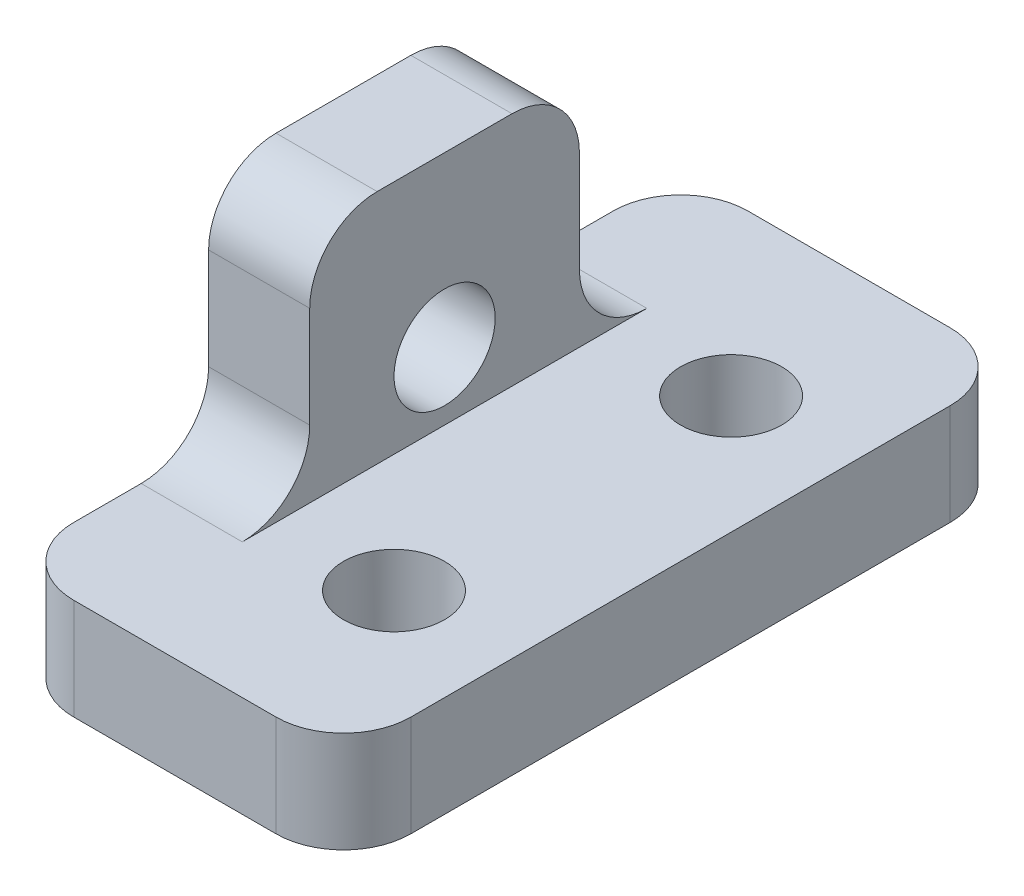
ISO-10303-21;
HEADER;
FILE_DESCRIPTION(('STEP AP214'),'2;1');
FILE_NAME('part.step','',(''),(''),'','','');
FILE_SCHEMA(('AUTOMOTIVE_DESIGN { 1 0 10303 214 1 1 1 1 }'));
ENDSEC;
DATA;
#1=APPLICATION_CONTEXT('core data for automotive mechanical design processes');
#2=APPLICATION_PROTOCOL_DEFINITION('international standard','automotive_design',2000,#1);
#3=PRODUCT_CONTEXT('',#1,'mechanical');
#4=PRODUCT('Part','Part','',(#3));
#5=PRODUCT_RELATED_PRODUCT_CATEGORY('part','',(#4));
#6=PRODUCT_DEFINITION_FORMATION('','',#4);
#7=PRODUCT_DEFINITION_CONTEXT('part definition',#1,'design');
#8=PRODUCT_DEFINITION('design','',#6,#7);
#9=PRODUCT_DEFINITION_SHAPE('','',#8);
#10=(LENGTH_UNIT() NAMED_UNIT(*) SI_UNIT(.MILLI.,.METRE.));
#11=(NAMED_UNIT(*) PLANE_ANGLE_UNIT() SI_UNIT($,.RADIAN.));
#12=(NAMED_UNIT(*) SI_UNIT($,.STERADIAN.) SOLID_ANGLE_UNIT());
#13=UNCERTAINTY_MEASURE_WITH_UNIT(LENGTH_MEASURE(1.E-05),#10,'distance_accuracy_value','');
#14=(GEOMETRIC_REPRESENTATION_CONTEXT(3) GLOBAL_UNCERTAINTY_ASSIGNED_CONTEXT((#13)) GLOBAL_UNIT_ASSIGNED_CONTEXT((#10,
#11,#12)) REPRESENTATION_CONTEXT('',''));
#15=CARTESIAN_POINT('',(0.,0.,0.));
#16=DIRECTION('',(0.,0.,1.));
#17=DIRECTION('',(1.,0.,0.));
#18=AXIS2_PLACEMENT_3D('',#15,#16,#17);
#19=CARTESIAN_POINT('',(3.,0.,0.));
#20=DIRECTION('',(1.,0.,0.));
#21=DIRECTION('',(0.,0.,-1.));
#22=AXIS2_PLACEMENT_3D('',#19,#20,#21);
#23=PLANE('',#22);
#24=DIRECTION('',(0.,1.,0.));
#25=VECTOR('',#24,1.);
#26=CARTESIAN_POINT('',(3.,10.,-14.));
#27=LINE('',#26,#25);
#28=CARTESIAN_POINT('',(3.,5.,-14.));
#29=VERTEX_POINT('',#28);
#30=CARTESIAN_POINT('',(3.,8.,-14.));
#31=VERTEX_POINT('',#30);
#32=EDGE_CURVE('E318',#29,#31,#27,.T.);
#33=ORIENTED_EDGE('',*,*,#32,.T.);
#34=CARTESIAN_POINT('',(3.,8.,-12.));
#35=DIRECTION('',(1.,0.,0.));
#36=DIRECTION('',(0.,0.,-1.));
#37=AXIS2_PLACEMENT_3D('',#34,#35,#36);
#38=CIRCLE('',#37,2.);
#39=CARTESIAN_POINT('',(3.,10.,-12.));
#40=VERTEX_POINT('',#39);
#41=EDGE_CURVE('E68',#31,#40,#38,.T.);
#42=ORIENTED_EDGE('',*,*,#41,.T.);
#43=DIRECTION('',(0.,0.,1.));
#44=VECTOR('',#43,1.);
#45=CARTESIAN_POINT('',(3.,10.,-6.));
#46=LINE('',#45,#44);
#47=CARTESIAN_POINT('',(3.,10.,-8.));
#48=VERTEX_POINT('',#47);
#49=EDGE_CURVE('E312',#40,#48,#46,.T.);
#50=ORIENTED_EDGE('',*,*,#49,.T.);
#51=CARTESIAN_POINT('',(3.,8.,-8.));
#52=DIRECTION('',(1.,0.,0.));
#53=DIRECTION('',(0.,0.,-1.));
#54=AXIS2_PLACEMENT_3D('',#51,#52,#53);
#55=CIRCLE('',#54,2.);
#56=CARTESIAN_POINT('',(3.,8.,-6.));
#57=VERTEX_POINT('',#56);
#58=EDGE_CURVE('E274',#48,#57,#55,.T.);
#59=ORIENTED_EDGE('',*,*,#58,.T.);
#60=DIRECTION('',(0.,-1.,0.));
#61=VECTOR('',#60,1.);
#62=CARTESIAN_POINT('',(3.,10.,-6.));
#63=LINE('',#62,#61);
#64=CARTESIAN_POINT('',(3.,5.,-6.));
#65=VERTEX_POINT('',#64);
#66=EDGE_CURVE('E309',#57,#65,#63,.T.);
#67=ORIENTED_EDGE('',*,*,#66,.T.);
#68=CARTESIAN_POINT('',(3.,5.,-4.));
#69=DIRECTION('',(1.,0.,0.));
#70=DIRECTION('',(0.,0.,-1.));
#71=AXIS2_PLACEMENT_3D('',#68,#69,#70);
#72=CIRCLE('',#71,2.);
#73=CARTESIAN_POINT('',(3.,3.,-4.));
#74=VERTEX_POINT('',#73);
#75=EDGE_CURVE('E11',#65,#74,#72,.F.);
#76=ORIENTED_EDGE('',*,*,#75,.T.);
#77=DIRECTION('',(0.,0.,1.));
#78=VECTOR('',#77,1.);
#79=CARTESIAN_POINT('',(3.,3.,0.));
#80=LINE('',#79,#78);
#81=CARTESIAN_POINT('',(3.,3.,-16.));
#82=VERTEX_POINT('',#81);
#83=EDGE_CURVE('E191',#82,#74,#80,.T.);
#84=ORIENTED_EDGE('',*,*,#83,.F.);
#85=CARTESIAN_POINT('',(3.,5.,-16.));
#86=DIRECTION('',(1.,0.,0.));
#87=DIRECTION('',(0.,0.,-1.));
#88=AXIS2_PLACEMENT_3D('',#85,#86,#87);
#89=CIRCLE('',#88,2.);
#90=EDGE_CURVE('E282',#82,#29,#89,.F.);
#91=ORIENTED_EDGE('',*,*,#90,.T.);
#92=EDGE_LOOP('',(#33,#42,#50,#59,#67,#76,#84,#91));
#93=FACE_BOUND('',#92,.T.);
#94=CARTESIAN_POINT('',(3.,5.,-10.));
#95=DIRECTION('',(1.,0.,0.));
#96=DIRECTION('',(0.,0.,-1.));
#97=AXIS2_PLACEMENT_3D('',#94,#95,#96);
#98=CIRCLE('',#97,1.5);
#99=CARTESIAN_POINT('',(3.,5.,-11.5));
#100=VERTEX_POINT('',#99);
#101=EDGE_CURVE('E327',#100,#100,#98,.T.);
#102=ORIENTED_EDGE('',*,*,#101,.F.);
#103=EDGE_LOOP('',(#102));
#104=FACE_BOUND('',#103,.T.);
#105=ADVANCED_FACE('F45',(#93,#104),#23,.T.);
#106=CARTESIAN_POINT('',(0.,0.,0.));
#107=DIRECTION('',(1.,0.,0.));
#108=DIRECTION('',(0.,0.,-1.));
#109=AXIS2_PLACEMENT_3D('',#106,#107,#108);
#110=PLANE('',#109);
#111=DIRECTION('',(0.,0.,1.));
#112=VECTOR('',#111,1.);
#113=CARTESIAN_POINT('',(0.,3.,-14.));
#114=LINE('',#113,#112);
#115=CARTESIAN_POINT('',(0.,3.,-18.));
#116=VERTEX_POINT('',#115);
#117=CARTESIAN_POINT('',(0.,3.,-16.));
#118=VERTEX_POINT('',#117);
#119=EDGE_CURVE('E326',#116,#118,#114,.T.);
#120=ORIENTED_EDGE('',*,*,#119,.F.);
#121=DIRECTION('',(0.,1.,0.));
#122=VECTOR('',#121,1.);
#123=CARTESIAN_POINT('',(0.,0.,-18.));
#124=LINE('',#123,#122);
#125=CARTESIAN_POINT('',(0.,0.,-18.));
#126=VERTEX_POINT('',#125);
#127=EDGE_CURVE('E226',#116,#126,#124,.F.);
#128=ORIENTED_EDGE('',*,*,#127,.T.);
#129=DIRECTION('',(0.,0.,-1.));
#130=VECTOR('',#129,1.);
#131=CARTESIAN_POINT('',(0.,0.,0.));
#132=LINE('',#131,#130);
#133=CARTESIAN_POINT('',(0.,0.,-2.));
#134=VERTEX_POINT('',#133);
#135=EDGE_CURVE('E322',#134,#126,#132,.T.);
#136=ORIENTED_EDGE('',*,*,#135,.F.);
#137=DIRECTION('',(0.,-1.,0.));
#138=VECTOR('',#137,1.);
#139=CARTESIAN_POINT('',(0.,0.,-2.));
#140=LINE('',#139,#138);
#141=CARTESIAN_POINT('',(0.,3.,-2.));
#142=VERTEX_POINT('',#141);
#143=EDGE_CURVE('E223',#134,#142,#140,.F.);
#144=ORIENTED_EDGE('',*,*,#143,.T.);
#145=DIRECTION('',(0.,0.,1.));
#146=VECTOR('',#145,1.);
#147=CARTESIAN_POINT('',(0.,3.,-6.));
#148=LINE('',#147,#146);
#149=CARTESIAN_POINT('',(0.,3.,-4.));
#150=VERTEX_POINT('',#149);
#151=EDGE_CURVE('E294',#150,#142,#148,.T.);
#152=ORIENTED_EDGE('',*,*,#151,.F.);
#153=CARTESIAN_POINT('',(0.,5.,-4.));
#154=DIRECTION('',(1.,0.,0.));
#155=DIRECTION('',(0.,0.,-1.));
#156=AXIS2_PLACEMENT_3D('',#153,#154,#155);
#157=CIRCLE('',#156,2.);
#158=CARTESIAN_POINT('',(0.,5.,-6.));
#159=VERTEX_POINT('',#158);
#160=EDGE_CURVE('E54',#150,#159,#157,.T.);
#161=ORIENTED_EDGE('',*,*,#160,.T.);
#162=DIRECTION('',(0.,-1.,0.));
#163=VECTOR('',#162,1.);
#164=CARTESIAN_POINT('',(0.,10.,-6.));
#165=LINE('',#164,#163);
#166=CARTESIAN_POINT('',(0.,8.,-6.));
#167=VERTEX_POINT('',#166);
#168=EDGE_CURVE('E292',#167,#159,#165,.T.);
#169=ORIENTED_EDGE('',*,*,#168,.F.);
#170=CARTESIAN_POINT('',(0.,8.,-8.));
#171=DIRECTION('',(1.,0.,0.));
#172=DIRECTION('',(0.,0.,-1.));
#173=AXIS2_PLACEMENT_3D('',#170,#171,#172);
#174=CIRCLE('',#173,2.);
#175=CARTESIAN_POINT('',(0.,10.,-8.));
#176=VERTEX_POINT('',#175);
#177=EDGE_CURVE('E217',#167,#176,#174,.F.);
#178=ORIENTED_EDGE('',*,*,#177,.T.);
#179=DIRECTION('',(0.,0.,1.));
#180=VECTOR('',#179,1.);
#181=CARTESIAN_POINT('',(0.,10.,-6.));
#182=LINE('',#181,#180);
#183=CARTESIAN_POINT('',(0.,10.,-12.));
#184=VERTEX_POINT('',#183);
#185=EDGE_CURVE('E304',#184,#176,#182,.T.);
#186=ORIENTED_EDGE('',*,*,#185,.F.);
#187=CARTESIAN_POINT('',(0.,8.,-12.));
#188=DIRECTION('',(1.,0.,0.));
#189=DIRECTION('',(0.,0.,-1.));
#190=AXIS2_PLACEMENT_3D('',#187,#188,#189);
#191=CIRCLE('',#190,2.);
#192=CARTESIAN_POINT('',(0.,8.,-14.));
#193=VERTEX_POINT('',#192);
#194=EDGE_CURVE('E220',#184,#193,#191,.F.);
#195=ORIENTED_EDGE('',*,*,#194,.T.);
#196=DIRECTION('',(0.,1.,0.));
#197=VECTOR('',#196,1.);
#198=CARTESIAN_POINT('',(0.,10.,-14.));
#199=LINE('',#198,#197);
#200=CARTESIAN_POINT('',(0.,5.,-14.));
#201=VERTEX_POINT('',#200);
#202=EDGE_CURVE('E331',#201,#193,#199,.T.);
#203=ORIENTED_EDGE('',*,*,#202,.F.);
#204=CARTESIAN_POINT('',(0.,5.,-16.));
#205=DIRECTION('',(1.,0.,0.));
#206=DIRECTION('',(0.,0.,-1.));
#207=AXIS2_PLACEMENT_3D('',#204,#205,#206);
#208=CIRCLE('',#207,2.);
#209=EDGE_CURVE('E279',#201,#118,#208,.T.);
#210=ORIENTED_EDGE('',*,*,#209,.T.);
#211=EDGE_LOOP('',(#120,#128,#136,#144,#152,#161,#169,#178,#186,#195,#203,#210));
#212=FACE_BOUND('',#211,.T.);
#213=CARTESIAN_POINT('',(0.,5.,-10.));
#214=DIRECTION('',(1.,0.,0.));
#215=DIRECTION('',(0.,0.,-1.));
#216=AXIS2_PLACEMENT_3D('',#213,#214,#215);
#217=CIRCLE('',#216,1.5);
#218=CARTESIAN_POINT('',(0.,5.,-11.5));
#219=VERTEX_POINT('',#218);
#220=EDGE_CURVE('E366',#219,#219,#217,.T.);
#221=ORIENTED_EDGE('',*,*,#220,.T.);
#222=EDGE_LOOP('',(#221));
#223=FACE_BOUND('',#222,.T.);
#224=ADVANCED_FACE('F290',(#212,#223),#110,.F.);
#225=CARTESIAN_POINT('',(3.,0.,0.));
#226=DIRECTION('',(0.,0.,-1.));
#227=DIRECTION('',(0.,1.,0.));
#228=AXIS2_PLACEMENT_3D('',#225,#226,#227);
#229=PLANE('',#228);
#230=DIRECTION('',(-1.,0.,0.));
#231=VECTOR('',#230,1.);
#232=CARTESIAN_POINT('',(3.,3.,0.));
#233=LINE('',#232,#231);
#234=CARTESIAN_POINT('',(8.,3.,0.));
#235=VERTEX_POINT('',#234);
#236=CARTESIAN_POINT('',(2.,3.,0.));
#237=VERTEX_POINT('',#236);
#238=EDGE_CURVE('E185',#235,#237,#233,.T.);
#239=ORIENTED_EDGE('',*,*,#238,.T.);
#240=DIRECTION('',(0.,-1.,0.));
#241=VECTOR('',#240,1.);
#242=CARTESIAN_POINT('',(2.,0.,0.));
#243=LINE('',#242,#241);
#244=CARTESIAN_POINT('',(2.,0.,0.));
#245=VERTEX_POINT('',#244);
#246=EDGE_CURVE('E257',#237,#245,#243,.T.);
#247=ORIENTED_EDGE('',*,*,#246,.T.);
#248=DIRECTION('',(-1.,0.,0.));
#249=VECTOR('',#248,1.);
#250=CARTESIAN_POINT('',(3.,0.,0.));
#251=LINE('',#250,#249);
#252=CARTESIAN_POINT('',(8.,0.,0.));
#253=VERTEX_POINT('',#252);
#254=EDGE_CURVE('E196',#253,#245,#251,.T.);
#255=ORIENTED_EDGE('',*,*,#254,.F.);
#256=DIRECTION('',(0.,-1.,0.));
#257=VECTOR('',#256,1.);
#258=CARTESIAN_POINT('',(8.,0.,0.));
#259=LINE('',#258,#257);
#260=EDGE_CURVE('E254',#253,#235,#259,.F.);
#261=ORIENTED_EDGE('',*,*,#260,.T.);
#262=EDGE_LOOP('',(#239,#247,#255,#261));
#263=FACE_BOUND('',#262,.T.);
#264=ADVANCED_FACE('F400',(#263),#229,.F.);
#265=CARTESIAN_POINT('',(3.,0.,0.));
#266=DIRECTION('',(0.,1.,0.));
#267=DIRECTION('',(0.,0.,1.));
#268=AXIS2_PLACEMENT_3D('',#265,#266,#267);
#269=PLANE('',#268);
#270=CARTESIAN_POINT('',(6.5,0.,-15.));
#271=DIRECTION('',(0.,1.,0.));
#272=DIRECTION('',(0.,0.,1.));
#273=AXIS2_PLACEMENT_3D('',#270,#271,#272);
#274=CIRCLE('',#273,1.5);
#275=CARTESIAN_POINT('',(6.5,0.,-13.5));
#276=VERTEX_POINT('',#275);
#277=EDGE_CURVE('E356',#276,#276,#274,.T.);
#278=ORIENTED_EDGE('',*,*,#277,.T.);
#279=EDGE_LOOP('',(#278));
#280=FACE_BOUND('',#279,.T.);
#281=CARTESIAN_POINT('',(6.5,0.,-5.));
#282=DIRECTION('',(0.,1.,0.));
#283=DIRECTION('',(0.,0.,1.));
#284=AXIS2_PLACEMENT_3D('',#281,#282,#283);
#285=CIRCLE('',#284,1.5);
#286=CARTESIAN_POINT('',(6.5,0.,-3.5));
#287=VERTEX_POINT('',#286);
#288=EDGE_CURVE('E346',#287,#287,#285,.T.);
#289=ORIENTED_EDGE('',*,*,#288,.T.);
#290=EDGE_LOOP('',(#289));
#291=FACE_BOUND('',#290,.T.);
#292=ORIENTED_EDGE('',*,*,#135,.T.);
#293=CARTESIAN_POINT('',(2.,0.,-18.));
#294=DIRECTION('',(0.,1.,0.));
#295=DIRECTION('',(0.,0.,1.));
#296=AXIS2_PLACEMENT_3D('',#293,#294,#295);
#297=CIRCLE('',#296,2.);
#298=CARTESIAN_POINT('',(2.,0.,-20.));
#299=VERTEX_POINT('',#298);
#300=EDGE_CURVE('E237',#126,#299,#297,.F.);
#301=ORIENTED_EDGE('',*,*,#300,.T.);
#302=DIRECTION('',(-1.,0.,0.));
#303=VECTOR('',#302,1.);
#304=CARTESIAN_POINT('',(3.,0.,-20.));
#305=LINE('',#304,#303);
#306=CARTESIAN_POINT('',(8.,0.,-20.));
#307=VERTEX_POINT('',#306);
#308=EDGE_CURVE('E184',#307,#299,#305,.T.);
#309=ORIENTED_EDGE('',*,*,#308,.F.);
#310=CARTESIAN_POINT('',(8.,0.,-18.));
#311=DIRECTION('',(0.,1.,0.));
#312=DIRECTION('',(0.,0.,1.));
#313=AXIS2_PLACEMENT_3D('',#310,#311,#312);
#314=CIRCLE('',#313,2.);
#315=CARTESIAN_POINT('',(10.,0.,-18.));
#316=VERTEX_POINT('',#315);
#317=EDGE_CURVE('E189',#307,#316,#314,.F.);
#318=ORIENTED_EDGE('',*,*,#317,.T.);
#319=DIRECTION('',(0.,0.,-1.));
#320=VECTOR('',#319,1.);
#321=CARTESIAN_POINT('',(10.,0.,0.));
#322=LINE('',#321,#320);
#323=CARTESIAN_POINT('',(10.,0.,-2.));
#324=VERTEX_POINT('',#323);
#325=EDGE_CURVE('E361',#324,#316,#322,.T.);
#326=ORIENTED_EDGE('',*,*,#325,.F.);
#327=CARTESIAN_POINT('',(8.,0.,-2.));
#328=DIRECTION('',(0.,1.,0.));
#329=DIRECTION('',(0.,0.,1.));
#330=AXIS2_PLACEMENT_3D('',#327,#328,#329);
#331=CIRCLE('',#330,2.);
#332=EDGE_CURVE('E229',#324,#253,#331,.F.);
#333=ORIENTED_EDGE('',*,*,#332,.T.);
#334=ORIENTED_EDGE('',*,*,#254,.T.);
#335=CARTESIAN_POINT('',(2.,0.,-2.));
#336=DIRECTION('',(0.,1.,0.));
#337=DIRECTION('',(0.,0.,1.));
#338=AXIS2_PLACEMENT_3D('',#335,#336,#337);
#339=CIRCLE('',#338,2.);
#340=EDGE_CURVE('E234',#245,#134,#339,.F.);
#341=ORIENTED_EDGE('',*,*,#340,.T.);
#342=EDGE_LOOP('',(#292,#301,#309,#318,#326,#333,#334,#341));
#343=FACE_BOUND('',#342,.T.);
#344=ADVANCED_FACE('F418',(#280,#291,#343),#269,.F.);
#345=CARTESIAN_POINT('',(3.,0.,-20.));
#346=DIRECTION('',(0.,0.,1.));
#347=DIRECTION('',(1.,0.,0.));
#348=AXIS2_PLACEMENT_3D('',#345,#346,#347);
#349=PLANE('',#348);
#350=ORIENTED_EDGE('',*,*,#308,.T.);
#351=DIRECTION('',(0.,1.,0.));
#352=VECTOR('',#351,1.);
#353=CARTESIAN_POINT('',(2.,0.,-20.));
#354=LINE('',#353,#352);
#355=CARTESIAN_POINT('',(2.,3.,-20.));
#356=VERTEX_POINT('',#355);
#357=EDGE_CURVE('E182',#299,#356,#354,.T.);
#358=ORIENTED_EDGE('',*,*,#357,.T.);
#359=DIRECTION('',(-1.,0.,0.));
#360=VECTOR('',#359,1.);
#361=CARTESIAN_POINT('',(3.,3.,-20.));
#362=LINE('',#361,#360);
#363=CARTESIAN_POINT('',(8.,3.,-20.));
#364=VERTEX_POINT('',#363);
#365=EDGE_CURVE('E164',#364,#356,#362,.T.);
#366=ORIENTED_EDGE('',*,*,#365,.F.);
#367=DIRECTION('',(0.,1.,0.));
#368=VECTOR('',#367,1.);
#369=CARTESIAN_POINT('',(8.,0.,-20.));
#370=LINE('',#369,#368);
#371=EDGE_CURVE('E179',#364,#307,#370,.F.);
#372=ORIENTED_EDGE('',*,*,#371,.T.);
#373=EDGE_LOOP('',(#350,#358,#366,#372));
#374=FACE_BOUND('',#373,.T.);
#375=ADVANCED_FACE('F178',(#374),#349,.F.);
#376=CARTESIAN_POINT('',(3.,10.,-14.));
#377=DIRECTION('',(0.,0.,1.));
#378=DIRECTION('',(0.,-1.,0.));
#379=AXIS2_PLACEMENT_3D('',#376,#377,#378);
#380=PLANE('',#379);
#381=ORIENTED_EDGE('',*,*,#32,.F.);
#382=DIRECTION('',(-1.,0.,0.));
#383=VECTOR('',#382,1.);
#384=CARTESIAN_POINT('',(0.,5.,-14.));
#385=LINE('',#384,#383);
#386=EDGE_CURVE('E243',#29,#201,#385,.T.);
#387=ORIENTED_EDGE('',*,*,#386,.T.);
#388=ORIENTED_EDGE('',*,*,#202,.T.);
#389=DIRECTION('',(-1.,0.,0.));
#390=VECTOR('',#389,1.);
#391=CARTESIAN_POINT('',(3.,8.,-14.));
#392=LINE('',#391,#390);
#393=EDGE_CURVE('E240',#193,#31,#392,.F.);
#394=ORIENTED_EDGE('',*,*,#393,.T.);
#395=EDGE_LOOP('',(#381,#387,#388,#394));
#396=FACE_BOUND('',#395,.T.);
#397=ADVANCED_FACE('F413',(#396),#380,.F.);
#398=CARTESIAN_POINT('',(3.,10.,-6.));
#399=DIRECTION('',(0.,-1.,0.));
#400=DIRECTION('',(0.,0.,-1.));
#401=AXIS2_PLACEMENT_3D('',#398,#399,#400);
#402=PLANE('',#401);
#403=ORIENTED_EDGE('',*,*,#49,.F.);
#404=DIRECTION('',(-1.,0.,0.));
#405=VECTOR('',#404,1.);
#406=CARTESIAN_POINT('',(3.,10.,-12.));
#407=LINE('',#406,#405);
#408=EDGE_CURVE('E270',#40,#184,#407,.T.);
#409=ORIENTED_EDGE('',*,*,#408,.T.);
#410=ORIENTED_EDGE('',*,*,#185,.T.);
#411=DIRECTION('',(-1.,0.,0.));
#412=VECTOR('',#411,1.);
#413=CARTESIAN_POINT('',(3.,10.,-8.));
#414=LINE('',#413,#412);
#415=EDGE_CURVE('E61',#176,#48,#414,.F.);
#416=ORIENTED_EDGE('',*,*,#415,.T.);
#417=EDGE_LOOP('',(#403,#409,#410,#416));
#418=FACE_BOUND('',#417,.T.);
#419=ADVANCED_FACE('F383',(#418),#402,.F.);
#420=CARTESIAN_POINT('',(3.,10.,-6.));
#421=DIRECTION('',(0.,0.,-1.));
#422=DIRECTION('',(0.,1.,0.));
#423=AXIS2_PLACEMENT_3D('',#420,#421,#422);
#424=PLANE('',#423);
#425=ORIENTED_EDGE('',*,*,#168,.T.);
#426=DIRECTION('',(-1.,0.,0.));
#427=VECTOR('',#426,1.);
#428=CARTESIAN_POINT('',(3.,5.,-6.));
#429=LINE('',#428,#427);
#430=EDGE_CURVE('E251',#159,#65,#429,.F.);
#431=ORIENTED_EDGE('',*,*,#430,.T.);
#432=ORIENTED_EDGE('',*,*,#66,.F.);
#433=DIRECTION('',(-1.,0.,0.));
#434=VECTOR('',#433,1.);
#435=CARTESIAN_POINT('',(3.,8.,-6.));
#436=LINE('',#435,#434);
#437=EDGE_CURVE('E247',#57,#167,#436,.T.);
#438=ORIENTED_EDGE('',*,*,#437,.T.);
#439=EDGE_LOOP('',(#425,#431,#432,#438));
#440=FACE_BOUND('',#439,.T.);
#441=ADVANCED_FACE('F299',(#440),#424,.F.);
#442=CARTESIAN_POINT('',(3.,3.,-6.));
#443=DIRECTION('',(0.,-1.,0.));
#444=DIRECTION('',(0.,0.,-1.));
#445=AXIS2_PLACEMENT_3D('',#442,#443,#444);
#446=PLANE('',#445);
#447=CARTESIAN_POINT('',(6.5,3.,-15.));
#448=DIRECTION('',(0.,-1.,0.));
#449=DIRECTION('',(0.,0.,-1.));
#450=AXIS2_PLACEMENT_3D('',#447,#448,#449);
#451=CIRCLE('',#450,1.5);
#452=CARTESIAN_POINT('',(6.5,3.,-16.5));
#453=VERTEX_POINT('',#452);
#454=EDGE_CURVE('E199',#453,#453,#451,.T.);
#455=ORIENTED_EDGE('',*,*,#454,.T.);
#456=EDGE_LOOP('',(#455));
#457=FACE_BOUND('',#456,.T.);
#458=CARTESIAN_POINT('',(6.5,3.,-5.));
#459=DIRECTION('',(0.,-1.,0.));
#460=DIRECTION('',(0.,0.,-1.));
#461=AXIS2_PLACEMENT_3D('',#458,#459,#460);
#462=CIRCLE('',#461,1.5);
#463=CARTESIAN_POINT('',(6.5,3.,-6.5));
#464=VERTEX_POINT('',#463);
#465=EDGE_CURVE('E343',#464,#464,#462,.T.);
#466=ORIENTED_EDGE('',*,*,#465,.T.);
#467=EDGE_LOOP('',(#466));
#468=FACE_BOUND('',#467,.T.);
#469=ORIENTED_EDGE('',*,*,#365,.T.);
#470=CARTESIAN_POINT('',(2.,3.,-18.));
#471=DIRECTION('',(0.,-1.,0.));
#472=DIRECTION('',(0.,0.,-1.));
#473=AXIS2_PLACEMENT_3D('',#470,#471,#472);
#474=CIRCLE('',#473,2.);
#475=EDGE_CURVE('E214',#356,#116,#474,.F.);
#476=ORIENTED_EDGE('',*,*,#475,.T.);
#477=ORIENTED_EDGE('',*,*,#119,.T.);
#478=DIRECTION('',(-1.,0.,0.));
#479=VECTOR('',#478,1.);
#480=CARTESIAN_POINT('',(3.,3.,-16.));
#481=LINE('',#480,#479);
#482=EDGE_CURVE('E210',#118,#82,#481,.F.);
#483=ORIENTED_EDGE('',*,*,#482,.T.);
#484=ORIENTED_EDGE('',*,*,#83,.T.);
#485=DIRECTION('',(-1.,0.,0.));
#486=VECTOR('',#485,1.);
#487=CARTESIAN_POINT('',(0.,3.,-4.));
#488=LINE('',#487,#486);
#489=EDGE_CURVE('E206',#74,#150,#488,.T.);
#490=ORIENTED_EDGE('',*,*,#489,.T.);
#491=ORIENTED_EDGE('',*,*,#151,.T.);
#492=CARTESIAN_POINT('',(2.,3.,-2.));
#493=DIRECTION('',(0.,-1.,0.));
#494=DIRECTION('',(0.,0.,-1.));
#495=AXIS2_PLACEMENT_3D('',#492,#493,#494);
#496=CIRCLE('',#495,2.);
#497=EDGE_CURVE('E172',#142,#237,#496,.F.);
#498=ORIENTED_EDGE('',*,*,#497,.T.);
#499=ORIENTED_EDGE('',*,*,#238,.F.);
#500=CARTESIAN_POINT('',(8.,3.,-2.));
#501=DIRECTION('',(0.,-1.,0.));
#502=DIRECTION('',(0.,0.,-1.));
#503=AXIS2_PLACEMENT_3D('',#500,#501,#502);
#504=CIRCLE('',#503,2.);
#505=CARTESIAN_POINT('',(10.,3.,-2.));
#506=VERTEX_POINT('',#505);
#507=EDGE_CURVE('E173',#235,#506,#504,.F.);
#508=ORIENTED_EDGE('',*,*,#507,.T.);
#509=DIRECTION('',(0.,0.,1.));
#510=VECTOR('',#509,1.);
#511=CARTESIAN_POINT('',(10.,3.,0.));
#512=LINE('',#511,#510);
#513=CARTESIAN_POINT('',(10.,3.,-18.));
#514=VERTEX_POINT('',#513);
#515=EDGE_CURVE('E166',#514,#506,#512,.T.);
#516=ORIENTED_EDGE('',*,*,#515,.F.);
#517=CARTESIAN_POINT('',(8.,3.,-18.));
#518=DIRECTION('',(0.,-1.,0.));
#519=DIRECTION('',(0.,0.,-1.));
#520=AXIS2_PLACEMENT_3D('',#517,#518,#519);
#521=CIRCLE('',#520,2.);
#522=EDGE_CURVE('E161',#514,#364,#521,.F.);
#523=ORIENTED_EDGE('',*,*,#522,.T.);
#524=EDGE_LOOP('',(#469,#476,#477,#483,#484,#490,#491,#498,#499,#508,#516,#523));
#525=FACE_BOUND('',#524,.T.);
#526=ADVANCED_FACE('F163',(#457,#468,#525),#446,.F.);
#527=CARTESIAN_POINT('',(3.,5.,-10.));
#528=DIRECTION('',(-1.,0.,0.));
#529=DIRECTION('',(0.,0.,1.));
#530=AXIS2_PLACEMENT_3D('',#527,#528,#529);
#531=CYLINDRICAL_SURFACE('',#530,1.5);
#532=ORIENTED_EDGE('',*,*,#101,.T.);
#533=EDGE_LOOP('',(#532));
#534=FACE_BOUND('',#533,.T.);
#535=ORIENTED_EDGE('',*,*,#220,.F.);
#536=EDGE_LOOP('',(#535));
#537=FACE_BOUND('',#536,.T.);
#538=ADVANCED_FACE('F403',(#534,#537),#531,.F.);
#539=CARTESIAN_POINT('',(10.,0.,0.));
#540=DIRECTION('',(-1.,0.,0.));
#541=DIRECTION('',(0.,0.,1.));
#542=AXIS2_PLACEMENT_3D('',#539,#540,#541);
#543=PLANE('',#542);
#544=ORIENTED_EDGE('',*,*,#325,.T.);
#545=DIRECTION('',(0.,1.,0.));
#546=VECTOR('',#545,1.);
#547=CARTESIAN_POINT('',(10.,0.,-18.));
#548=LINE('',#547,#546);
#549=EDGE_CURVE('E265',#316,#514,#548,.T.);
#550=ORIENTED_EDGE('',*,*,#549,.T.);
#551=ORIENTED_EDGE('',*,*,#515,.T.);
#552=DIRECTION('',(0.,-1.,0.));
#553=VECTOR('',#552,1.);
#554=CARTESIAN_POINT('',(10.,0.,-2.));
#555=LINE('',#554,#553);
#556=EDGE_CURVE('E261',#506,#324,#555,.T.);
#557=ORIENTED_EDGE('',*,*,#556,.T.);
#558=EDGE_LOOP('',(#544,#550,#551,#557));
#559=FACE_BOUND('',#558,.T.);
#560=ADVANCED_FACE('F497',(#559),#543,.F.);
#561=CARTESIAN_POINT('',(6.5,-9.5,-5.));
#562=DIRECTION('',(0.,1.,0.));
#563=DIRECTION('',(0.,0.,1.));
#564=AXIS2_PLACEMENT_3D('',#561,#562,#563);
#565=CYLINDRICAL_SURFACE('',#564,1.5);
#566=ORIENTED_EDGE('',*,*,#465,.F.);
#567=EDGE_LOOP('',(#566));
#568=FACE_BOUND('',#567,.T.);
#569=ORIENTED_EDGE('',*,*,#288,.F.);
#570=EDGE_LOOP('',(#569));
#571=FACE_BOUND('',#570,.T.);
#572=ADVANCED_FACE('F488',(#568,#571),#565,.F.);
#573=CARTESIAN_POINT('',(6.5,-9.5,-15.));
#574=DIRECTION('',(0.,1.,0.));
#575=DIRECTION('',(0.,0.,1.));
#576=AXIS2_PLACEMENT_3D('',#573,#574,#575);
#577=CYLINDRICAL_SURFACE('',#576,1.5);
#578=ORIENTED_EDGE('',*,*,#454,.F.);
#579=EDGE_LOOP('',(#578));
#580=FACE_BOUND('',#579,.T.);
#581=ORIENTED_EDGE('',*,*,#277,.F.);
#582=EDGE_LOOP('',(#581));
#583=FACE_BOUND('',#582,.T.);
#584=ADVANCED_FACE('F429',(#580,#583),#577,.F.);
#585=CARTESIAN_POINT('',(2.,0.,-18.));
#586=DIRECTION('',(0.,1.,0.));
#587=DIRECTION('',(0.,0.,1.));
#588=AXIS2_PLACEMENT_3D('',#585,#586,#587);
#589=CYLINDRICAL_SURFACE('',#588,2.);
#590=ORIENTED_EDGE('',*,*,#300,.F.);
#591=ORIENTED_EDGE('',*,*,#127,.F.);
#592=ORIENTED_EDGE('',*,*,#475,.F.);
#593=ORIENTED_EDGE('',*,*,#357,.F.);
#594=EDGE_LOOP('',(#590,#591,#592,#593));
#595=FACE_BOUND('',#594,.T.);
#596=ADVANCED_FACE('F425',(#595),#589,.T.);
#597=CARTESIAN_POINT('',(3.,5.,-16.));
#598=DIRECTION('',(1.,0.,0.));
#599=DIRECTION('',(0.,0.,-1.));
#600=AXIS2_PLACEMENT_3D('',#597,#598,#599);
#601=CYLINDRICAL_SURFACE('',#600,2.);
#602=ORIENTED_EDGE('',*,*,#90,.F.);
#603=ORIENTED_EDGE('',*,*,#482,.F.);
#604=ORIENTED_EDGE('',*,*,#209,.F.);
#605=ORIENTED_EDGE('',*,*,#386,.F.);
#606=EDGE_LOOP('',(#602,#603,#604,#605));
#607=FACE_BOUND('',#606,.T.);
#608=ADVANCED_FACE('F428',(#607),#601,.F.);
#609=CARTESIAN_POINT('',(3.,5.,-4.));
#610=DIRECTION('',(1.,0.,0.));
#611=DIRECTION('',(0.,0.,-1.));
#612=AXIS2_PLACEMENT_3D('',#609,#610,#611);
#613=CYLINDRICAL_SURFACE('',#612,2.);
#614=ORIENTED_EDGE('',*,*,#75,.F.);
#615=ORIENTED_EDGE('',*,*,#430,.F.);
#616=ORIENTED_EDGE('',*,*,#160,.F.);
#617=ORIENTED_EDGE('',*,*,#489,.F.);
#618=EDGE_LOOP('',(#614,#615,#616,#617));
#619=FACE_BOUND('',#618,.T.);
#620=ADVANCED_FACE('F307',(#619),#613,.F.);
#621=CARTESIAN_POINT('',(2.,0.,-2.));
#622=DIRECTION('',(0.,-1.,0.));
#623=DIRECTION('',(0.,0.,-1.));
#624=AXIS2_PLACEMENT_3D('',#621,#622,#623);
#625=CYLINDRICAL_SURFACE('',#624,2.);
#626=ORIENTED_EDGE('',*,*,#497,.F.);
#627=ORIENTED_EDGE('',*,*,#143,.F.);
#628=ORIENTED_EDGE('',*,*,#340,.F.);
#629=ORIENTED_EDGE('',*,*,#246,.F.);
#630=EDGE_LOOP('',(#626,#627,#628,#629));
#631=FACE_BOUND('',#630,.T.);
#632=ADVANCED_FACE('F436',(#631),#625,.T.);
#633=CARTESIAN_POINT('',(8.,0.,-18.));
#634=DIRECTION('',(0.,1.,0.));
#635=DIRECTION('',(0.,0.,1.));
#636=AXIS2_PLACEMENT_3D('',#633,#634,#635);
#637=CYLINDRICAL_SURFACE('',#636,2.);
#638=ORIENTED_EDGE('',*,*,#317,.F.);
#639=ORIENTED_EDGE('',*,*,#371,.F.);
#640=ORIENTED_EDGE('',*,*,#522,.F.);
#641=ORIENTED_EDGE('',*,*,#549,.F.);
#642=EDGE_LOOP('',(#638,#639,#640,#641));
#643=FACE_BOUND('',#642,.T.);
#644=ADVANCED_FACE('F188',(#643),#637,.T.);
#645=CARTESIAN_POINT('',(3.,8.,-12.));
#646=DIRECTION('',(-1.,0.,0.));
#647=DIRECTION('',(0.,0.,1.));
#648=AXIS2_PLACEMENT_3D('',#645,#646,#647);
#649=CYLINDRICAL_SURFACE('',#648,2.);
#650=ORIENTED_EDGE('',*,*,#41,.F.);
#651=ORIENTED_EDGE('',*,*,#393,.F.);
#652=ORIENTED_EDGE('',*,*,#194,.F.);
#653=ORIENTED_EDGE('',*,*,#408,.F.);
#654=EDGE_LOOP('',(#650,#651,#652,#653));
#655=FACE_BOUND('',#654,.T.);
#656=ADVANCED_FACE('F381',(#655),#649,.T.);
#657=CARTESIAN_POINT('',(3.,8.,-8.));
#658=DIRECTION('',(-1.,0.,0.));
#659=DIRECTION('',(0.,0.,1.));
#660=AXIS2_PLACEMENT_3D('',#657,#658,#659);
#661=CYLINDRICAL_SURFACE('',#660,2.);
#662=ORIENTED_EDGE('',*,*,#58,.F.);
#663=ORIENTED_EDGE('',*,*,#415,.F.);
#664=ORIENTED_EDGE('',*,*,#177,.F.);
#665=ORIENTED_EDGE('',*,*,#437,.F.);
#666=EDGE_LOOP('',(#662,#663,#664,#665));
#667=FACE_BOUND('',#666,.T.);
#668=ADVANCED_FACE('F386',(#667),#661,.T.);
#669=CARTESIAN_POINT('',(8.,0.,-2.));
#670=DIRECTION('',(0.,-1.,0.));
#671=DIRECTION('',(0.,0.,-1.));
#672=AXIS2_PLACEMENT_3D('',#669,#670,#671);
#673=CYLINDRICAL_SURFACE('',#672,2.);
#674=ORIENTED_EDGE('',*,*,#507,.F.);
#675=ORIENTED_EDGE('',*,*,#260,.F.);
#676=ORIENTED_EDGE('',*,*,#332,.F.);
#677=ORIENTED_EDGE('',*,*,#556,.F.);
#678=EDGE_LOOP('',(#674,#675,#676,#677));
#679=FACE_BOUND('',#678,.T.);
#680=ADVANCED_FACE('F47',(#679),#673,.T.);
#681=CLOSED_SHELL('',(#105,#224,#264,#344,#375,#397,#419,#441,#526,#538,#560,#572,#584,#596,
#608,#620,#632,#644,#656,#668,#680));
#682=MANIFOLD_SOLID_BREP('B2',#681);
#683=ADVANCED_BREP_SHAPE_REPRESENTATION('',(#18,#682),#14);
#684=SHAPE_DEFINITION_REPRESENTATION(#9,#683);
ENDSEC;
END-ISO-10303-21;
